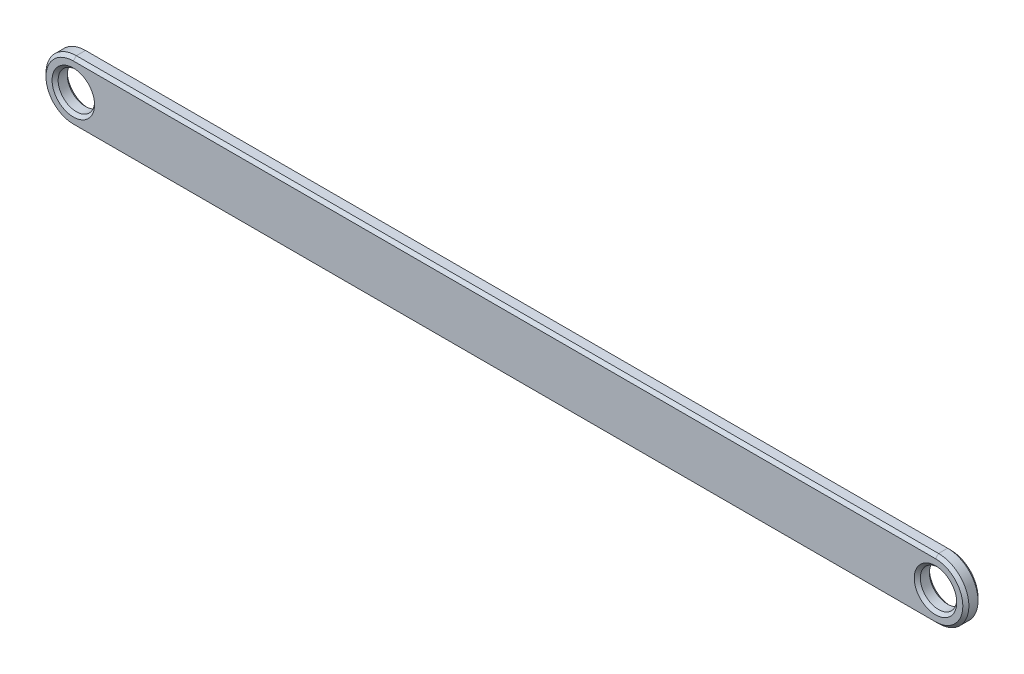
ISO-10303-21;
HEADER;
FILE_DESCRIPTION(('STEP AP214'),'2;1');
FILE_NAME('part.step','',(''),(''),'','','');
FILE_SCHEMA(('AUTOMOTIVE_DESIGN { 1 0 10303 214 1 1 1 1 }'));
ENDSEC;
DATA;
#1=APPLICATION_CONTEXT('core data for automotive mechanical design processes');
#2=APPLICATION_PROTOCOL_DEFINITION('international standard','automotive_design',2000,#1);
#3=PRODUCT_CONTEXT('',#1,'mechanical');
#4=PRODUCT('Part','Part','',(#3));
#5=PRODUCT_RELATED_PRODUCT_CATEGORY('part','',(#4));
#6=PRODUCT_DEFINITION_FORMATION('','',#4);
#7=PRODUCT_DEFINITION_CONTEXT('part definition',#1,'design');
#8=PRODUCT_DEFINITION('design','',#6,#7);
#9=PRODUCT_DEFINITION_SHAPE('','',#8);
#10=(LENGTH_UNIT() NAMED_UNIT(*) SI_UNIT(.MILLI.,.METRE.));
#11=(NAMED_UNIT(*) PLANE_ANGLE_UNIT() SI_UNIT($,.RADIAN.));
#12=(NAMED_UNIT(*) SI_UNIT($,.STERADIAN.) SOLID_ANGLE_UNIT());
#13=UNCERTAINTY_MEASURE_WITH_UNIT(LENGTH_MEASURE(1.E-05),#10,'distance_accuracy_value','');
#14=(GEOMETRIC_REPRESENTATION_CONTEXT(3) GLOBAL_UNCERTAINTY_ASSIGNED_CONTEXT((#13)) GLOBAL_UNIT_ASSIGNED_CONTEXT((#10,
#11,#12)) REPRESENTATION_CONTEXT('',''));
#15=CARTESIAN_POINT('',(0.,0.,0.));
#16=DIRECTION('',(0.,0.,1.));
#17=DIRECTION('',(1.,0.,0.));
#18=AXIS2_PLACEMENT_3D('',#15,#16,#17);
#19=CARTESIAN_POINT('',(-710.,0.,25.));
#20=DIRECTION('',(0.,0.,1.));
#21=DIRECTION('',(1.,0.,0.));
#22=AXIS2_PLACEMENT_3D('',#19,#20,#21);
#23=PLANE('',#22);
#24=CARTESIAN_POINT('',(710.,1.73899845478924E-13,25.));
#25=DIRECTION('',(0.,0.,1.));
#26=DIRECTION('',(1.,0.,0.));
#27=AXIS2_PLACEMENT_3D('',#24,#25,#26);
#28=CIRCLE('',#27,35.0000000000006);
#29=CARTESIAN_POINT('',(745.000000000001,1.73899845478924E-13,25.));
#30=VERTEX_POINT('',#29);
#31=EDGE_CURVE('E11',#30,#30,#28,.F.);
#32=ORIENTED_EDGE('',*,*,#31,.T.);
#33=EDGE_LOOP('',(#32));
#34=FACE_BOUND('',#33,.T.);
#35=CARTESIAN_POINT('',(710.,1.73899845478924E-13,25.));
#36=DIRECTION('',(0.,0.,1.));
#37=DIRECTION('',(1.,0.,0.));
#38=AXIS2_PLACEMENT_3D('',#35,#36,#37);
#39=CIRCLE('',#38,44.9999999999999);
#40=CARTESIAN_POINT('',(710.,-44.9999999999997,25.));
#41=VERTEX_POINT('',#40);
#42=CARTESIAN_POINT('',(710.,45.0000000000001,25.));
#43=VERTEX_POINT('',#42);
#44=EDGE_CURVE('E57',#41,#43,#39,.T.);
#45=ORIENTED_EDGE('',*,*,#44,.T.);
#46=DIRECTION('',(-1.,0.,0.));
#47=VECTOR('',#46,1.);
#48=CARTESIAN_POINT('',(-710.,44.9999999999999,25.));
#49=LINE('',#48,#47);
#50=CARTESIAN_POINT('',(-710.,44.9999999999999,25.));
#51=VERTEX_POINT('',#50);
#52=EDGE_CURVE('E49',#43,#51,#49,.T.);
#53=ORIENTED_EDGE('',*,*,#52,.T.);
#54=CARTESIAN_POINT('',(-710.,0.,25.));
#55=DIRECTION('',(0.,0.,1.));
#56=DIRECTION('',(1.,0.,0.));
#57=AXIS2_PLACEMENT_3D('',#54,#55,#56);
#58=CIRCLE('',#57,44.9999999999999);
#59=CARTESIAN_POINT('',(-710.,-44.9999999999999,25.));
#60=VERTEX_POINT('',#59);
#61=EDGE_CURVE('E194',#51,#60,#58,.T.);
#62=ORIENTED_EDGE('',*,*,#61,.T.);
#63=DIRECTION('',(1.,0.,0.));
#64=VECTOR('',#63,1.);
#65=CARTESIAN_POINT('',(710.,-44.9999999999997,25.));
#66=LINE('',#65,#64);
#67=EDGE_CURVE('E62',#60,#41,#66,.T.);
#68=ORIENTED_EDGE('',*,*,#67,.T.);
#69=EDGE_LOOP('',(#45,#53,#62,#68));
#70=FACE_BOUND('',#69,.T.);
#71=CARTESIAN_POINT('',(-710.,0.,25.));
#72=DIRECTION('',(0.,0.,1.));
#73=DIRECTION('',(1.,0.,0.));
#74=AXIS2_PLACEMENT_3D('',#71,#72,#73);
#75=CIRCLE('',#74,35.0000000000006);
#76=CARTESIAN_POINT('',(-674.999999999999,0.,25.));
#77=VERTEX_POINT('',#76);
#78=EDGE_CURVE('E190',#77,#77,#75,.F.);
#79=ORIENTED_EDGE('',*,*,#78,.T.);
#80=EDGE_LOOP('',(#79));
#81=FACE_BOUND('',#80,.T.);
#82=ADVANCED_FACE('F39',(#34,#70,#81),#23,.T.);
#83=CARTESIAN_POINT('',(-710.,0.,0.));
#84=DIRECTION('',(0.,0.,1.));
#85=DIRECTION('',(1.,0.,0.));
#86=AXIS2_PLACEMENT_3D('',#83,#84,#85);
#87=PLANE('',#86);
#88=CARTESIAN_POINT('',(710.,1.73899845478924E-13,0.));
#89=DIRECTION('',(0.,0.,1.));
#90=DIRECTION('',(1.,0.,0.));
#91=AXIS2_PLACEMENT_3D('',#88,#89,#90);
#92=CIRCLE('',#91,34.9999999999999);
#93=CARTESIAN_POINT('',(745.,1.73899845478924E-13,0.));
#94=VERTEX_POINT('',#93);
#95=EDGE_CURVE('E142',#94,#94,#92,.T.);
#96=ORIENTED_EDGE('',*,*,#95,.T.);
#97=EDGE_LOOP('',(#96));
#98=FACE_BOUND('',#97,.T.);
#99=CARTESIAN_POINT('',(-710.,0.,0.));
#100=DIRECTION('',(0.,0.,1.));
#101=DIRECTION('',(1.,0.,0.));
#102=AXIS2_PLACEMENT_3D('',#99,#100,#101);
#103=CIRCLE('',#102,34.9999999999999);
#104=CARTESIAN_POINT('',(-675.,0.,0.));
#105=VERTEX_POINT('',#104);
#106=EDGE_CURVE('E137',#105,#105,#103,.T.);
#107=ORIENTED_EDGE('',*,*,#106,.T.);
#108=EDGE_LOOP('',(#107));
#109=FACE_BOUND('',#108,.T.);
#110=CARTESIAN_POINT('',(710.,1.73899845478924E-13,0.));
#111=DIRECTION('',(0.,0.,1.));
#112=DIRECTION('',(1.,0.,0.));
#113=AXIS2_PLACEMENT_3D('',#110,#111,#112);
#114=CIRCLE('',#113,44.9999999999994);
#115=CARTESIAN_POINT('',(710.,44.9999999999996,0.));
#116=VERTEX_POINT('',#115);
#117=CARTESIAN_POINT('',(710.,-44.9999999999993,0.));
#118=VERTEX_POINT('',#117);
#119=EDGE_CURVE('E135',#116,#118,#114,.F.);
#120=ORIENTED_EDGE('',*,*,#119,.T.);
#121=DIRECTION('',(-1.,0.,0.));
#122=VECTOR('',#121,1.);
#123=CARTESIAN_POINT('',(-710.,-44.9999999999994,0.));
#124=LINE('',#123,#122);
#125=CARTESIAN_POINT('',(-710.,-44.9999999999994,0.));
#126=VERTEX_POINT('',#125);
#127=EDGE_CURVE('E112',#118,#126,#124,.T.);
#128=ORIENTED_EDGE('',*,*,#127,.T.);
#129=CARTESIAN_POINT('',(-710.,0.,0.));
#130=DIRECTION('',(0.,0.,1.));
#131=DIRECTION('',(1.,0.,0.));
#132=AXIS2_PLACEMENT_3D('',#129,#130,#131);
#133=CIRCLE('',#132,44.9999999999994);
#134=CARTESIAN_POINT('',(-710.,44.9999999999994,0.));
#135=VERTEX_POINT('',#134);
#136=EDGE_CURVE('E123',#126,#135,#133,.F.);
#137=ORIENTED_EDGE('',*,*,#136,.T.);
#138=DIRECTION('',(1.,0.,0.));
#139=VECTOR('',#138,1.);
#140=CARTESIAN_POINT('',(-710.,44.9999999999994,0.));
#141=LINE('',#140,#139);
#142=EDGE_CURVE('E130',#135,#116,#141,.T.);
#143=ORIENTED_EDGE('',*,*,#142,.T.);
#144=EDGE_LOOP('',(#120,#128,#137,#143));
#145=FACE_BOUND('',#144,.T.);
#146=ADVANCED_FACE('F133',(#98,#109,#145),#87,.F.);
#147=CARTESIAN_POINT('',(-710.,0.,25.));
#148=DIRECTION('',(0.,0.,-1.));
#149=DIRECTION('',(-1.,0.,0.));
#150=AXIS2_PLACEMENT_3D('',#147,#148,#149);
#151=CYLINDRICAL_SURFACE('',#150,50.);
#152=DIRECTION('',(0.,0.,-1.));
#153=VECTOR('',#152,1.);
#154=CARTESIAN_POINT('',(-710.,50.,25.));
#155=LINE('',#154,#153);
#156=CARTESIAN_POINT('',(-710.,50.,20.0000000000001));
#157=VERTEX_POINT('',#156);
#158=CARTESIAN_POINT('',(-710.,50.,5.00000000000034));
#159=VERTEX_POINT('',#158);
#160=EDGE_CURVE('E210',#157,#159,#155,.T.);
#161=ORIENTED_EDGE('',*,*,#160,.T.);
#162=CARTESIAN_POINT('',(-710.,0.,5.00000000000034));
#163=DIRECTION('',(0.,0.,1.));
#164=DIRECTION('',(1.,0.,0.));
#165=AXIS2_PLACEMENT_3D('',#162,#163,#164);
#166=CIRCLE('',#165,50.);
#167=CARTESIAN_POINT('',(-710.,-50.,5.00000000000034));
#168=VERTEX_POINT('',#167);
#169=EDGE_CURVE('E187',#159,#168,#166,.T.);
#170=ORIENTED_EDGE('',*,*,#169,.T.);
#171=DIRECTION('',(0.,0.,-1.));
#172=VECTOR('',#171,1.);
#173=CARTESIAN_POINT('',(-710.,-50.,25.));
#174=LINE('',#173,#172);
#175=CARTESIAN_POINT('',(-710.,-50.,20.0000000000001));
#176=VERTEX_POINT('',#175);
#177=EDGE_CURVE('E131',#176,#168,#174,.T.);
#178=ORIENTED_EDGE('',*,*,#177,.F.);
#179=CARTESIAN_POINT('',(-710.,0.,20.0000000000001));
#180=DIRECTION('',(0.,0.,1.));
#181=DIRECTION('',(1.,0.,0.));
#182=AXIS2_PLACEMENT_3D('',#179,#180,#181);
#183=CIRCLE('',#182,50.);
#184=EDGE_CURVE('E184',#176,#157,#183,.F.);
#185=ORIENTED_EDGE('',*,*,#184,.T.);
#186=EDGE_LOOP('',(#161,#170,#178,#185));
#187=FACE_BOUND('',#186,.T.);
#188=ADVANCED_FACE('F240',(#187),#151,.T.);
#189=CARTESIAN_POINT('',(710.,-49.9999999999998,25.));
#190=DIRECTION('',(0.,1.,0.));
#191=DIRECTION('',(-1.,0.,0.));
#192=AXIS2_PLACEMENT_3D('',#189,#190,#191);
#193=PLANE('',#192);
#194=ORIENTED_EDGE('',*,*,#177,.T.);
#195=DIRECTION('',(1.,0.,0.));
#196=VECTOR('',#195,1.);
#197=CARTESIAN_POINT('',(710.,-49.9999999999998,5.00000000000034));
#198=LINE('',#197,#196);
#199=CARTESIAN_POINT('',(710.,-49.9999999999998,5.00000000000034));
#200=VERTEX_POINT('',#199);
#201=EDGE_CURVE('E115',#168,#200,#198,.T.);
#202=ORIENTED_EDGE('',*,*,#201,.T.);
#203=DIRECTION('',(0.,0.,-1.));
#204=VECTOR('',#203,1.);
#205=CARTESIAN_POINT('',(710.,-49.9999999999998,25.));
#206=LINE('',#205,#204);
#207=CARTESIAN_POINT('',(710.,-49.9999999999998,20.0000000000001));
#208=VERTEX_POINT('',#207);
#209=EDGE_CURVE('E237',#208,#200,#206,.T.);
#210=ORIENTED_EDGE('',*,*,#209,.F.);
#211=DIRECTION('',(-1.,0.,0.));
#212=VECTOR('',#211,1.);
#213=CARTESIAN_POINT('',(-710.,-50.,20.0000000000001));
#214=LINE('',#213,#212);
#215=EDGE_CURVE('E166',#208,#176,#214,.T.);
#216=ORIENTED_EDGE('',*,*,#215,.T.);
#217=EDGE_LOOP('',(#194,#202,#210,#216));
#218=FACE_BOUND('',#217,.T.);
#219=ADVANCED_FACE('F235',(#218),#193,.F.);
#220=CARTESIAN_POINT('',(710.,1.73899845478924E-13,25.));
#221=DIRECTION('',(0.,0.,-1.));
#222=DIRECTION('',(-1.,0.,0.));
#223=AXIS2_PLACEMENT_3D('',#220,#221,#222);
#224=CYLINDRICAL_SURFACE('',#223,50.);
#225=ORIENTED_EDGE('',*,*,#209,.T.);
#226=CARTESIAN_POINT('',(710.,1.73899845478924E-13,5.00000000000034));
#227=DIRECTION('',(0.,0.,1.));
#228=DIRECTION('',(1.,0.,0.));
#229=AXIS2_PLACEMENT_3D('',#226,#227,#228);
#230=CIRCLE('',#229,50.);
#231=CARTESIAN_POINT('',(710.,50.0000000000002,5.00000000000034));
#232=VERTEX_POINT('',#231);
#233=EDGE_CURVE('E174',#200,#232,#230,.T.);
#234=ORIENTED_EDGE('',*,*,#233,.T.);
#235=DIRECTION('',(0.,0.,-1.));
#236=VECTOR('',#235,1.);
#237=CARTESIAN_POINT('',(710.,50.0000000000002,25.));
#238=LINE('',#237,#236);
#239=CARTESIAN_POINT('',(710.,50.0000000000002,20.0000000000001));
#240=VERTEX_POINT('',#239);
#241=EDGE_CURVE('E245',#240,#232,#238,.T.);
#242=ORIENTED_EDGE('',*,*,#241,.F.);
#243=CARTESIAN_POINT('',(710.,1.73899845478924E-13,20.0000000000001));
#244=DIRECTION('',(0.,0.,1.));
#245=DIRECTION('',(1.,0.,0.));
#246=AXIS2_PLACEMENT_3D('',#243,#244,#245);
#247=CIRCLE('',#246,50.);
#248=EDGE_CURVE('E171',#240,#208,#247,.F.);
#249=ORIENTED_EDGE('',*,*,#248,.T.);
#250=EDGE_LOOP('',(#225,#234,#242,#249));
#251=FACE_BOUND('',#250,.T.);
#252=ADVANCED_FACE('F259',(#251),#224,.T.);
#253=CARTESIAN_POINT('',(710.,50.0000000000002,25.));
#254=DIRECTION('',(0.,-1.,0.));
#255=DIRECTION('',(1.,0.,0.));
#256=AXIS2_PLACEMENT_3D('',#253,#254,#255);
#257=PLANE('',#256);
#258=ORIENTED_EDGE('',*,*,#241,.T.);
#259=DIRECTION('',(-1.,0.,0.));
#260=VECTOR('',#259,1.);
#261=CARTESIAN_POINT('',(710.,50.0000000000002,5.00000000000034));
#262=LINE('',#261,#260);
#263=EDGE_CURVE('E181',#232,#159,#262,.T.);
#264=ORIENTED_EDGE('',*,*,#263,.T.);
#265=ORIENTED_EDGE('',*,*,#160,.F.);
#266=DIRECTION('',(1.,0.,0.));
#267=VECTOR('',#266,1.);
#268=CARTESIAN_POINT('',(710.,50.0000000000002,20.0000000000001));
#269=LINE('',#268,#267);
#270=EDGE_CURVE('E177',#157,#240,#269,.T.);
#271=ORIENTED_EDGE('',*,*,#270,.T.);
#272=EDGE_LOOP('',(#258,#264,#265,#271));
#273=FACE_BOUND('',#272,.T.);
#274=ADVANCED_FACE('F265',(#273),#257,.F.);
#275=CARTESIAN_POINT('',(-710.,0.,25.));
#276=DIRECTION('',(0.,0.,-1.));
#277=DIRECTION('',(-1.,0.,0.));
#278=AXIS2_PLACEMENT_3D('',#275,#276,#277);
#279=CYLINDRICAL_SURFACE('',#278,30.);
#280=CARTESIAN_POINT('',(-710.,0.,4.99999999999975));
#281=DIRECTION('',(0.,0.,1.));
#282=DIRECTION('',(1.,0.,0.));
#283=AXIS2_PLACEMENT_3D('',#280,#281,#282);
#284=CIRCLE('',#283,30.);
#285=CARTESIAN_POINT('',(-680.,0.,4.99999999999975));
#286=VERTEX_POINT('',#285);
#287=EDGE_CURVE('E162',#286,#286,#284,.F.);
#288=ORIENTED_EDGE('',*,*,#287,.T.);
#289=EDGE_LOOP('',(#288));
#290=FACE_BOUND('',#289,.T.);
#291=CARTESIAN_POINT('',(-710.,0.,19.9999999999996));
#292=DIRECTION('',(0.,0.,1.));
#293=DIRECTION('',(1.,0.,0.));
#294=AXIS2_PLACEMENT_3D('',#291,#292,#293);
#295=CIRCLE('',#294,30.);
#296=CARTESIAN_POINT('',(-680.,0.,19.9999999999996));
#297=VERTEX_POINT('',#296);
#298=EDGE_CURVE('E158',#297,#297,#295,.T.);
#299=ORIENTED_EDGE('',*,*,#298,.T.);
#300=EDGE_LOOP('',(#299));
#301=FACE_BOUND('',#300,.T.);
#302=ADVANCED_FACE('F281',(#290,#301),#279,.F.);
#303=CARTESIAN_POINT('',(710.,1.73899845478924E-13,25.));
#304=DIRECTION('',(0.,0.,-1.));
#305=DIRECTION('',(-1.,0.,0.));
#306=AXIS2_PLACEMENT_3D('',#303,#304,#305);
#307=CYLINDRICAL_SURFACE('',#306,30.);
#308=CARTESIAN_POINT('',(710.,1.73899845478924E-13,4.99999999999975));
#309=DIRECTION('',(0.,0.,1.));
#310=DIRECTION('',(1.,0.,0.));
#311=AXIS2_PLACEMENT_3D('',#308,#309,#310);
#312=CIRCLE('',#311,30.);
#313=CARTESIAN_POINT('',(740.,1.73899845478924E-13,4.99999999999975));
#314=VERTEX_POINT('',#313);
#315=EDGE_CURVE('E154',#314,#314,#312,.F.);
#316=ORIENTED_EDGE('',*,*,#315,.T.);
#317=EDGE_LOOP('',(#316));
#318=FACE_BOUND('',#317,.T.);
#319=CARTESIAN_POINT('',(710.,1.73899845478924E-13,19.9999999999996));
#320=DIRECTION('',(0.,0.,1.));
#321=DIRECTION('',(1.,0.,0.));
#322=AXIS2_PLACEMENT_3D('',#319,#320,#321);
#323=CIRCLE('',#322,30.);
#324=CARTESIAN_POINT('',(740.,1.73899845478924E-13,19.9999999999996));
#325=VERTEX_POINT('',#324);
#326=EDGE_CURVE('E150',#325,#325,#323,.T.);
#327=ORIENTED_EDGE('',*,*,#326,.T.);
#328=EDGE_LOOP('',(#327));
#329=FACE_BOUND('',#328,.T.);
#330=ADVANCED_FACE('F283',(#318,#329),#307,.F.);
#331=CARTESIAN_POINT('',(710.,1.73899845478924E-13,0.));
#332=DIRECTION('',(0.,0.,-1.));
#333=DIRECTION('',(-1.,0.,0.));
#334=AXIS2_PLACEMENT_3D('',#331,#332,#333);
#335=CONICAL_SURFACE('',#334,34.9999999999999,0.78539816339746);
#336=ORIENTED_EDGE('',*,*,#315,.F.);
#337=EDGE_LOOP('',(#336));
#338=FACE_BOUND('',#337,.T.);
#339=ORIENTED_EDGE('',*,*,#95,.F.);
#340=EDGE_LOOP('',(#339));
#341=FACE_BOUND('',#340,.T.);
#342=ADVANCED_FACE('F290',(#338,#341),#335,.F.);
#343=CARTESIAN_POINT('',(-710.,0.,0.));
#344=DIRECTION('',(0.,0.,-1.));
#345=DIRECTION('',(-1.,0.,0.));
#346=AXIS2_PLACEMENT_3D('',#343,#344,#345);
#347=CONICAL_SURFACE('',#346,34.9999999999999,0.78539816339746);
#348=ORIENTED_EDGE('',*,*,#287,.F.);
#349=EDGE_LOOP('',(#348));
#350=FACE_BOUND('',#349,.T.);
#351=ORIENTED_EDGE('',*,*,#106,.F.);
#352=EDGE_LOOP('',(#351));
#353=FACE_BOUND('',#352,.T.);
#354=ADVANCED_FACE('F306',(#350,#353),#347,.F.);
#355=CARTESIAN_POINT('',(710.,50.0000000000002,5.00000000000034));
#356=DIRECTION('',(0.,-0.707106781186532,0.707106781186563));
#357=DIRECTION('',(-1.,0.,0.));
#358=AXIS2_PLACEMENT_3D('',#355,#356,#357);
#359=PLANE('',#358);
#360=DIRECTION('',(0.,0.707106781186563,0.707106781186532));
#361=VECTOR('',#360,1.);
#362=CARTESIAN_POINT('',(710.,44.9999999999996,0.));
#363=LINE('',#362,#361);
#364=EDGE_CURVE('E119',#116,#232,#363,.T.);
#365=ORIENTED_EDGE('',*,*,#364,.F.);
#366=ORIENTED_EDGE('',*,*,#142,.F.);
#367=DIRECTION('',(0.,-0.707106781186563,-0.707106781186532));
#368=VECTOR('',#367,1.);
#369=CARTESIAN_POINT('',(-710.,50.,5.00000000000034));
#370=LINE('',#369,#368);
#371=EDGE_CURVE('E126',#159,#135,#370,.T.);
#372=ORIENTED_EDGE('',*,*,#371,.F.);
#373=ORIENTED_EDGE('',*,*,#263,.F.);
#374=EDGE_LOOP('',(#365,#366,#372,#373));
#375=FACE_BOUND('',#374,.T.);
#376=ADVANCED_FACE('F252',(#375),#359,.F.);
#377=CARTESIAN_POINT('',(-710.,0.,5.00000000000034));
#378=DIRECTION('',(0.,0.,1.));
#379=DIRECTION('',(1.,0.,0.));
#380=AXIS2_PLACEMENT_3D('',#377,#378,#379);
#381=CONICAL_SURFACE('',#380,50.,0.78539816339747);
#382=ORIENTED_EDGE('',*,*,#371,.T.);
#383=ORIENTED_EDGE('',*,*,#136,.F.);
#384=DIRECTION('',(0.,0.707106781186563,-0.707106781186532));
#385=VECTOR('',#384,1.);
#386=CARTESIAN_POINT('',(-710.,-50.,5.00000000000034));
#387=LINE('',#386,#385);
#388=EDGE_CURVE('E108',#168,#126,#387,.T.);
#389=ORIENTED_EDGE('',*,*,#388,.F.);
#390=ORIENTED_EDGE('',*,*,#169,.F.);
#391=EDGE_LOOP('',(#382,#383,#389,#390));
#392=FACE_BOUND('',#391,.T.);
#393=ADVANCED_FACE('F124',(#392),#381,.T.);
#394=CARTESIAN_POINT('',(710.,1.73899845478924E-13,5.00000000000034));
#395=DIRECTION('',(0.,0.,1.));
#396=DIRECTION('',(1.,0.,0.));
#397=AXIS2_PLACEMENT_3D('',#394,#395,#396);
#398=CONICAL_SURFACE('',#397,50.,0.78539816339747);
#399=ORIENTED_EDGE('',*,*,#364,.T.);
#400=ORIENTED_EDGE('',*,*,#233,.F.);
#401=DIRECTION('',(0.,-0.707106781186563,0.707106781186532));
#402=VECTOR('',#401,1.);
#403=CARTESIAN_POINT('',(710.,-44.9999999999993,0.));
#404=LINE('',#403,#402);
#405=EDGE_CURVE('E120',#118,#200,#404,.T.);
#406=ORIENTED_EDGE('',*,*,#405,.F.);
#407=ORIENTED_EDGE('',*,*,#119,.F.);
#408=EDGE_LOOP('',(#399,#400,#406,#407));
#409=FACE_BOUND('',#408,.T.);
#410=ADVANCED_FACE('F255',(#409),#398,.T.);
#411=CARTESIAN_POINT('',(710.,-49.9999999999998,5.00000000000034));
#412=DIRECTION('',(0.,0.707106781186532,0.707106781186563));
#413=DIRECTION('',(1.,0.,0.));
#414=AXIS2_PLACEMENT_3D('',#411,#412,#413);
#415=PLANE('',#414);
#416=ORIENTED_EDGE('',*,*,#388,.T.);
#417=ORIENTED_EDGE('',*,*,#127,.F.);
#418=ORIENTED_EDGE('',*,*,#405,.T.);
#419=ORIENTED_EDGE('',*,*,#201,.F.);
#420=EDGE_LOOP('',(#416,#417,#418,#419));
#421=FACE_BOUND('',#420,.T.);
#422=ADVANCED_FACE('F110',(#421),#415,.F.);
#423=CARTESIAN_POINT('',(710.,1.73899845478924E-13,19.9999999999996));
#424=DIRECTION('',(0.,0.,1.));
#425=DIRECTION('',(1.,0.,0.));
#426=AXIS2_PLACEMENT_3D('',#423,#424,#425);
#427=CONICAL_SURFACE('',#426,30.,0.78539816339746);
#428=ORIENTED_EDGE('',*,*,#31,.F.);
#429=EDGE_LOOP('',(#428));
#430=FACE_BOUND('',#429,.T.);
#431=ORIENTED_EDGE('',*,*,#326,.F.);
#432=EDGE_LOOP('',(#431));
#433=FACE_BOUND('',#432,.T.);
#434=ADVANCED_FACE('F313',(#430,#433),#427,.F.);
#435=CARTESIAN_POINT('',(-710.,-44.9999999999999,25.));
#436=DIRECTION('',(0.,-0.707106781186532,0.707106781186563));
#437=DIRECTION('',(-1.,0.,0.));
#438=AXIS2_PLACEMENT_3D('',#435,#436,#437);
#439=PLANE('',#438);
#440=DIRECTION('',(0.,0.707106781186563,0.707106781186532));
#441=VECTOR('',#440,1.);
#442=CARTESIAN_POINT('',(-710.,-50.,20.0000000000001));
#443=LINE('',#442,#441);
#444=EDGE_CURVE('E216',#176,#60,#443,.T.);
#445=ORIENTED_EDGE('',*,*,#444,.F.);
#446=ORIENTED_EDGE('',*,*,#215,.F.);
#447=DIRECTION('',(0.,-0.707106781186563,-0.707106781186532));
#448=VECTOR('',#447,1.);
#449=CARTESIAN_POINT('',(710.,-44.9999999999997,25.));
#450=LINE('',#449,#448);
#451=EDGE_CURVE('E43',#41,#208,#450,.T.);
#452=ORIENTED_EDGE('',*,*,#451,.F.);
#453=ORIENTED_EDGE('',*,*,#67,.F.);
#454=EDGE_LOOP('',(#445,#446,#452,#453));
#455=FACE_BOUND('',#454,.T.);
#456=ADVANCED_FACE('F230',(#455),#439,.T.);
#457=CARTESIAN_POINT('',(710.,1.73899845478924E-13,25.));
#458=DIRECTION('',(0.,0.,-1.));
#459=DIRECTION('',(-1.,0.,0.));
#460=AXIS2_PLACEMENT_3D('',#457,#458,#459);
#461=CONICAL_SURFACE('',#460,44.9999999999999,0.78539816339747);
#462=ORIENTED_EDGE('',*,*,#451,.T.);
#463=ORIENTED_EDGE('',*,*,#248,.F.);
#464=DIRECTION('',(0.,0.707106781186563,-0.707106781186532));
#465=VECTOR('',#464,1.);
#466=CARTESIAN_POINT('',(710.,45.0000000000001,25.));
#467=LINE('',#466,#465);
#468=EDGE_CURVE('E214',#43,#240,#467,.T.);
#469=ORIENTED_EDGE('',*,*,#468,.F.);
#470=ORIENTED_EDGE('',*,*,#44,.F.);
#471=EDGE_LOOP('',(#462,#463,#469,#470));
#472=FACE_BOUND('',#471,.T.);
#473=ADVANCED_FACE('F227',(#472),#461,.T.);
#474=CARTESIAN_POINT('',(-710.,0.,25.));
#475=DIRECTION('',(0.,0.,-1.));
#476=DIRECTION('',(-1.,0.,0.));
#477=AXIS2_PLACEMENT_3D('',#474,#475,#476);
#478=CONICAL_SURFACE('',#477,44.9999999999999,0.78539816339747);
#479=ORIENTED_EDGE('',*,*,#444,.T.);
#480=ORIENTED_EDGE('',*,*,#61,.F.);
#481=DIRECTION('',(0.,-0.707106781186563,0.707106781186532));
#482=VECTOR('',#481,1.);
#483=CARTESIAN_POINT('',(-710.,50.,20.0000000000001));
#484=LINE('',#483,#482);
#485=EDGE_CURVE('E211',#157,#51,#484,.T.);
#486=ORIENTED_EDGE('',*,*,#485,.F.);
#487=ORIENTED_EDGE('',*,*,#184,.F.);
#488=EDGE_LOOP('',(#479,#480,#486,#487));
#489=FACE_BOUND('',#488,.T.);
#490=ADVANCED_FACE('F270',(#489),#478,.T.);
#491=CARTESIAN_POINT('',(-710.,44.9999999999999,25.));
#492=DIRECTION('',(0.,0.707106781186532,0.707106781186563));
#493=DIRECTION('',(1.,0.,0.));
#494=AXIS2_PLACEMENT_3D('',#491,#492,#493);
#495=PLANE('',#494);
#496=ORIENTED_EDGE('',*,*,#468,.T.);
#497=ORIENTED_EDGE('',*,*,#270,.F.);
#498=ORIENTED_EDGE('',*,*,#485,.T.);
#499=ORIENTED_EDGE('',*,*,#52,.F.);
#500=EDGE_LOOP('',(#496,#497,#498,#499));
#501=FACE_BOUND('',#500,.T.);
#502=ADVANCED_FACE('F268',(#501),#495,.T.);
#503=CARTESIAN_POINT('',(-710.,0.,19.9999999999996));
#504=DIRECTION('',(0.,0.,1.));
#505=DIRECTION('',(1.,0.,0.));
#506=AXIS2_PLACEMENT_3D('',#503,#504,#505);
#507=CONICAL_SURFACE('',#506,30.,0.78539816339746);
#508=ORIENTED_EDGE('',*,*,#78,.F.);
#509=EDGE_LOOP('',(#508));
#510=FACE_BOUND('',#509,.T.);
#511=ORIENTED_EDGE('',*,*,#298,.F.);
#512=EDGE_LOOP('',(#511));
#513=FACE_BOUND('',#512,.T.);
#514=ADVANCED_FACE('F41',(#510,#513),#507,.F.);
#515=CLOSED_SHELL('',(#82,#146,#188,#219,#252,#274,#302,#330,#342,#354,#376,#393,#410,#422,#434,
#456,#473,#490,#502,#514));
#516=MANIFOLD_SOLID_BREP('B2',#515);
#517=ADVANCED_BREP_SHAPE_REPRESENTATION('',(#18,#516),#14);
#518=SHAPE_DEFINITION_REPRESENTATION(#9,#517);
ENDSEC;
END-ISO-10303-21;
